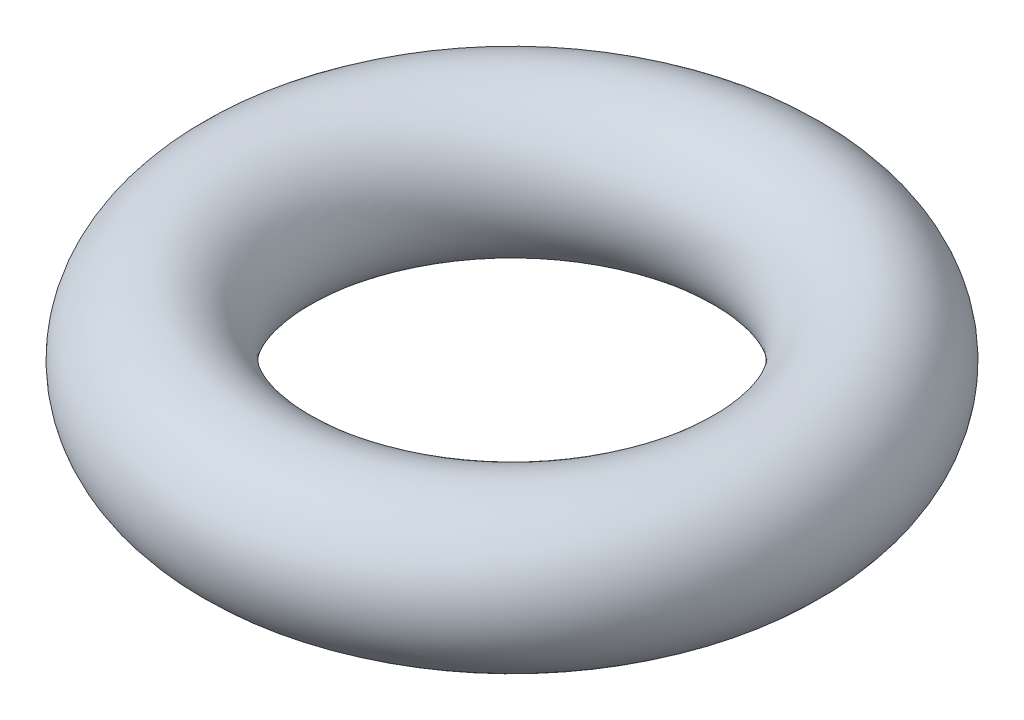
ISO-10303-21;
HEADER;
FILE_DESCRIPTION(('STEP AP214'),'2;1');
FILE_NAME('part.step','',(''),(''),'','','');
FILE_SCHEMA(('AUTOMOTIVE_DESIGN { 1 0 10303 214 1 1 1 1 }'));
ENDSEC;
DATA;
#1=APPLICATION_CONTEXT('core data for automotive mechanical design processes');
#2=APPLICATION_PROTOCOL_DEFINITION('international standard','automotive_design',2000,#1);
#3=PRODUCT_CONTEXT('',#1,'mechanical');
#4=PRODUCT('Part','Part','',(#3));
#5=PRODUCT_RELATED_PRODUCT_CATEGORY('part','',(#4));
#6=PRODUCT_DEFINITION_FORMATION('','',#4);
#7=PRODUCT_DEFINITION_CONTEXT('part definition',#1,'design');
#8=PRODUCT_DEFINITION('design','',#6,#7);
#9=PRODUCT_DEFINITION_SHAPE('','',#8);
#10=(LENGTH_UNIT() NAMED_UNIT(*) SI_UNIT(.MILLI.,.METRE.));
#11=(NAMED_UNIT(*) PLANE_ANGLE_UNIT() SI_UNIT($,.RADIAN.));
#12=(NAMED_UNIT(*) SI_UNIT($,.STERADIAN.) SOLID_ANGLE_UNIT());
#13=UNCERTAINTY_MEASURE_WITH_UNIT(LENGTH_MEASURE(1.E-05),#10,'distance_accuracy_value','');
#14=(GEOMETRIC_REPRESENTATION_CONTEXT(3) GLOBAL_UNCERTAINTY_ASSIGNED_CONTEXT((#13)) GLOBAL_UNIT_ASSIGNED_CONTEXT((#10,
#11,#12)) REPRESENTATION_CONTEXT('',''));
#15=CARTESIAN_POINT('',(0.,0.,0.));
#16=DIRECTION('',(0.,0.,1.));
#17=DIRECTION('',(1.,0.,0.));
#18=AXIS2_PLACEMENT_3D('',#15,#16,#17);
#19=CARTESIAN_POINT('',(0.,0.,0.));
#20=DIRECTION('',(0.,-1.,0.));
#21=DIRECTION('',(0.,0.,-1.));
#22=AXIS2_PLACEMENT_3D('',#19,#20,#21);
#23=TOROIDAL_SURFACE('',#22,8.5,2.5);
#24=ADVANCED_FACE('F14',(),#23,.T.);
#25=CLOSED_SHELL('',(#24));
#26=MANIFOLD_SOLID_BREP('B1',#25);
#27=ADVANCED_BREP_SHAPE_REPRESENTATION('',(#18,#26),#14);
#28=SHAPE_DEFINITION_REPRESENTATION(#9,#27);
ENDSEC;
END-ISO-10303-21;
